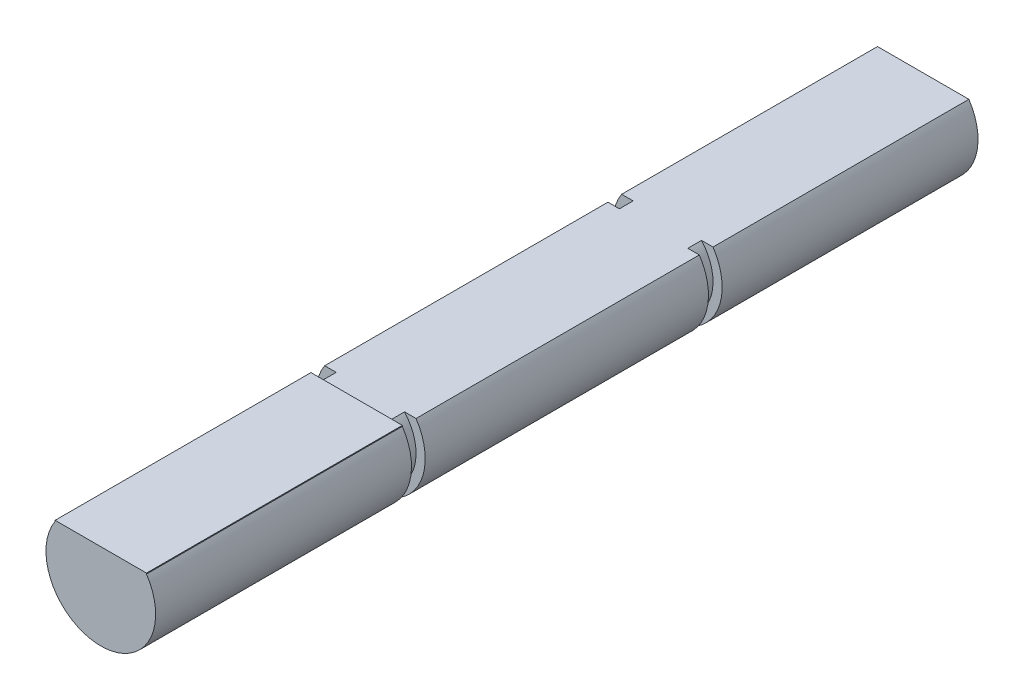
ISO-10303-21;
HEADER;
FILE_DESCRIPTION(('STEP AP214'),'2;1');
FILE_NAME('part.step','',(''),(''),'','','');
FILE_SCHEMA(('AUTOMOTIVE_DESIGN { 1 0 10303 214 1 1 1 1 }'));
ENDSEC;
DATA;
#1=APPLICATION_CONTEXT('core data for automotive mechanical design processes');
#2=APPLICATION_PROTOCOL_DEFINITION('international standard','automotive_design',2000,#1);
#3=PRODUCT_CONTEXT('',#1,'mechanical');
#4=PRODUCT('Part','Part','',(#3));
#5=PRODUCT_RELATED_PRODUCT_CATEGORY('part','',(#4));
#6=PRODUCT_DEFINITION_FORMATION('','',#4);
#7=PRODUCT_DEFINITION_CONTEXT('part definition',#1,'design');
#8=PRODUCT_DEFINITION('design','',#6,#7);
#9=PRODUCT_DEFINITION_SHAPE('','',#8);
#10=(LENGTH_UNIT() NAMED_UNIT(*) SI_UNIT(.MILLI.,.METRE.));
#11=(NAMED_UNIT(*) PLANE_ANGLE_UNIT() SI_UNIT($,.RADIAN.));
#12=(NAMED_UNIT(*) SI_UNIT($,.STERADIAN.) SOLID_ANGLE_UNIT());
#13=UNCERTAINTY_MEASURE_WITH_UNIT(LENGTH_MEASURE(1.E-05),#10,'distance_accuracy_value','');
#14=(GEOMETRIC_REPRESENTATION_CONTEXT(3) GLOBAL_UNCERTAINTY_ASSIGNED_CONTEXT((#13)) GLOBAL_UNIT_ASSIGNED_CONTEXT((#10,
#11,#12)) REPRESENTATION_CONTEXT('',''));
#15=CARTESIAN_POINT('',(0.,0.,0.));
#16=DIRECTION('',(0.,0.,1.));
#17=DIRECTION('',(1.,0.,0.));
#18=AXIS2_PLACEMENT_3D('',#15,#16,#17);
#19=CARTESIAN_POINT('',(-5.,3.3166247903554,45.));
#20=DIRECTION('',(0.,-1.,0.));
#21=DIRECTION('',(1.,0.,0.));
#22=AXIS2_PLACEMENT_3D('',#19,#20,#21);
#23=PLANE('',#22);
#24=DIRECTION('',(-1.,0.,0.));
#25=VECTOR('',#24,1.);
#26=CARTESIAN_POINT('',(-5.,3.3166247903554,17.));
#27=LINE('',#26,#25);
#28=CARTESIAN_POINT('',(3.74165738677392,3.3166247903554,17.));
#29=VERTEX_POINT('',#28);
#30=CARTESIAN_POINT('',(-3.74165738677381,3.3166247903554,17.));
#31=VERTEX_POINT('',#30);
#32=EDGE_CURVE('E148',#29,#31,#27,.T.);
#33=ORIENTED_EDGE('',*,*,#32,.F.);
#34=DIRECTION('',(0.,0.,1.));
#35=VECTOR('',#34,1.);
#36=CARTESIAN_POINT('',(3.7416573867773,3.3166247903554,1000.));
#37=LINE('',#36,#35);
#38=CARTESIAN_POINT('',(3.74165738677392,3.3166247903554,15.4999999999999));
#39=VERTEX_POINT('',#38);
#40=EDGE_CURVE('E208',#29,#39,#37,.F.);
#41=ORIENTED_EDGE('',*,*,#40,.T.);
#42=DIRECTION('',(1.,0.,0.));
#43=VECTOR('',#42,1.);
#44=CARTESIAN_POINT('',(-5.0000000000001,3.3166247903554,15.5));
#45=LINE('',#44,#43);
#46=CARTESIAN_POINT('',(5.,3.3166247903554,15.5));
#47=VERTEX_POINT('',#46);
#48=EDGE_CURVE('E207',#39,#47,#45,.T.);
#49=ORIENTED_EDGE('',*,*,#48,.T.);
#50=DIRECTION('',(0.,0.,-1.));
#51=VECTOR('',#50,1.);
#52=CARTESIAN_POINT('',(5.,3.3166247903554,45.));
#53=LINE('',#52,#51);
#54=CARTESIAN_POINT('',(5.,3.3166247903554,-15.5));
#55=VERTEX_POINT('',#54);
#56=EDGE_CURVE('E203',#47,#55,#53,.T.);
#57=ORIENTED_EDGE('',*,*,#56,.T.);
#58=DIRECTION('',(1.,0.,0.));
#59=VECTOR('',#58,1.);
#60=CARTESIAN_POINT('',(-5.0000000000001,3.3166247903554,-15.5));
#61=LINE('',#60,#59);
#62=CARTESIAN_POINT('',(3.74165738677392,3.3166247903554,-15.4999999999999));
#63=VERTEX_POINT('',#62);
#64=EDGE_CURVE('E178',#63,#55,#61,.T.);
#65=ORIENTED_EDGE('',*,*,#64,.F.);
#66=DIRECTION('',(0.,0.,-1.));
#67=VECTOR('',#66,1.);
#68=CARTESIAN_POINT('',(3.7416573867773,3.3166247903554,-1000.));
#69=LINE('',#68,#67);
#70=CARTESIAN_POINT('',(3.74165738677392,3.3166247903554,-17.));
#71=VERTEX_POINT('',#70);
#72=EDGE_CURVE('E181',#71,#63,#69,.F.);
#73=ORIENTED_EDGE('',*,*,#72,.F.);
#74=DIRECTION('',(-1.,0.,0.));
#75=VECTOR('',#74,1.);
#76=CARTESIAN_POINT('',(-5.0000000000001,3.3166247903554,-17.));
#77=LINE('',#76,#75);
#78=CARTESIAN_POINT('',(4.99999999999999,3.3166247903554,-17.));
#79=VERTEX_POINT('',#78);
#80=EDGE_CURVE('E185',#79,#71,#77,.T.);
#81=ORIENTED_EDGE('',*,*,#80,.F.);
#82=DIRECTION('',(0.,0.,1.));
#83=VECTOR('',#82,1.);
#84=CARTESIAN_POINT('',(5.,3.3166247903554,-45.));
#85=LINE('',#84,#83);
#86=CARTESIAN_POINT('',(5.,3.3166247903554,-45.));
#87=VERTEX_POINT('',#86);
#88=EDGE_CURVE('E175',#87,#79,#85,.T.);
#89=ORIENTED_EDGE('',*,*,#88,.F.);
#90=DIRECTION('',(-1.,0.,0.));
#91=VECTOR('',#90,1.);
#92=CARTESIAN_POINT('',(-5.,3.3166247903554,-45.));
#93=LINE('',#92,#91);
#94=CARTESIAN_POINT('',(-5.,3.3166247903554,-45.));
#95=VERTEX_POINT('',#94);
#96=EDGE_CURVE('E170',#87,#95,#93,.T.);
#97=ORIENTED_EDGE('',*,*,#96,.T.);
#98=DIRECTION('',(0.,0.,1.));
#99=VECTOR('',#98,1.);
#100=CARTESIAN_POINT('',(-5.,3.3166247903554,-45.));
#101=LINE('',#100,#99);
#102=CARTESIAN_POINT('',(-4.99999999999987,3.31662479035539,-17.));
#103=VERTEX_POINT('',#102);
#104=EDGE_CURVE('E172',#95,#103,#101,.T.);
#105=ORIENTED_EDGE('',*,*,#104,.T.);
#106=CARTESIAN_POINT('',(-3.74165738677381,3.3166247903554,-17.));
#107=VERTEX_POINT('',#106);
#108=EDGE_CURVE('E188',#107,#103,#77,.T.);
#109=ORIENTED_EDGE('',*,*,#108,.F.);
#110=DIRECTION('',(0.,0.,-1.));
#111=VECTOR('',#110,1.);
#112=CARTESIAN_POINT('',(-3.74165738677044,3.3166247903554,-1000.));
#113=LINE('',#112,#111);
#114=CARTESIAN_POINT('',(-3.74165738677382,3.3166247903554,-15.5));
#115=VERTEX_POINT('',#114);
#116=EDGE_CURVE('E189',#115,#107,#113,.T.);
#117=ORIENTED_EDGE('',*,*,#116,.F.);
#118=CARTESIAN_POINT('',(-4.99999999999988,3.3166247903554,-15.5));
#119=VERTEX_POINT('',#118);
#120=EDGE_CURVE('E182',#119,#115,#61,.T.);
#121=ORIENTED_EDGE('',*,*,#120,.F.);
#122=DIRECTION('',(0.,0.,-1.));
#123=VECTOR('',#122,1.);
#124=CARTESIAN_POINT('',(-5.,3.3166247903554,45.));
#125=LINE('',#124,#123);
#126=CARTESIAN_POINT('',(-4.99999999999988,3.3166247903554,15.5));
#127=VERTEX_POINT('',#126);
#128=EDGE_CURVE('E201',#127,#119,#125,.T.);
#129=ORIENTED_EDGE('',*,*,#128,.F.);
#130=CARTESIAN_POINT('',(-3.74165738677382,3.3166247903554,15.5));
#131=VERTEX_POINT('',#130);
#132=EDGE_CURVE('E47',#127,#131,#45,.T.);
#133=ORIENTED_EDGE('',*,*,#132,.T.);
#134=DIRECTION('',(0.,0.,1.));
#135=VECTOR('',#134,1.);
#136=CARTESIAN_POINT('',(-3.74165738677044,3.3166247903554,1000.));
#137=LINE('',#136,#135);
#138=EDGE_CURVE('E11',#131,#31,#137,.T.);
#139=ORIENTED_EDGE('',*,*,#138,.T.);
#140=EDGE_LOOP('',(#33,#41,#49,#57,#65,#73,#81,#89,#97,#105,#109,#117,#121,#129,#133,#139));
#141=FACE_BOUND('',#140,.T.);
#142=ADVANCED_FACE('F39',(#141),#23,.F.);
#143=CARTESIAN_POINT('',(0.,0.,45.));
#144=DIRECTION('',(0.,0.,-1.));
#145=DIRECTION('',(-1.,0.,0.));
#146=AXIS2_PLACEMENT_3D('',#143,#144,#145);
#147=CYLINDRICAL_SURFACE('',#146,6.);
#148=CARTESIAN_POINT('',(-5.,3.3166247903554,45.));
#149=VERTEX_POINT('',#148);
#150=CARTESIAN_POINT('',(-4.99999999999987,3.31662479035539,17.));
#151=VERTEX_POINT('',#150);
#152=EDGE_CURVE('E151',#149,#151,#125,.T.);
#153=ORIENTED_EDGE('',*,*,#152,.T.);
#154=CARTESIAN_POINT('',(0.,0.,17.));
#155=DIRECTION('',(0.,0.,1.));
#156=DIRECTION('',(1.,0.,0.));
#157=AXIS2_PLACEMENT_3D('',#154,#155,#156);
#158=CIRCLE('',#157,5.99999999999994);
#159=CARTESIAN_POINT('',(4.99999999999999,3.3166247903554,17.));
#160=VERTEX_POINT('',#159);
#161=EDGE_CURVE('E196',#151,#160,#158,.T.);
#162=ORIENTED_EDGE('',*,*,#161,.T.);
#163=CARTESIAN_POINT('',(5.,3.3166247903554,45.));
#164=VERTEX_POINT('',#163);
#165=EDGE_CURVE('E204',#164,#160,#53,.T.);
#166=ORIENTED_EDGE('',*,*,#165,.F.);
#167=CARTESIAN_POINT('',(0.,0.,45.));
#168=DIRECTION('',(0.,0.,1.));
#169=DIRECTION('',(1.,0.,0.));
#170=AXIS2_PLACEMENT_3D('',#167,#168,#169);
#171=CIRCLE('',#170,6.);
#172=EDGE_CURVE('E62',#149,#164,#171,.T.);
#173=ORIENTED_EDGE('',*,*,#172,.F.);
#174=EDGE_LOOP('',(#153,#162,#166,#173));
#175=FACE_BOUND('',#174,.T.);
#176=ADVANCED_FACE('F250',(#175),#147,.T.);
#177=ORIENTED_EDGE('',*,*,#56,.F.);
#178=CARTESIAN_POINT('',(0.,0.,15.5));
#179=DIRECTION('',(0.,0.,1.));
#180=DIRECTION('',(1.,0.,0.));
#181=AXIS2_PLACEMENT_3D('',#178,#179,#180);
#182=CIRCLE('',#181,5.99999999999995);
#183=EDGE_CURVE('E54',#127,#47,#182,.T.);
#184=ORIENTED_EDGE('',*,*,#183,.F.);
#185=ORIENTED_EDGE('',*,*,#128,.T.);
#186=CARTESIAN_POINT('',(0.,0.,-15.5));
#187=DIRECTION('',(0.,0.,1.));
#188=DIRECTION('',(1.,0.,0.));
#189=AXIS2_PLACEMENT_3D('',#186,#187,#188);
#190=CIRCLE('',#189,5.99999999999995);
#191=EDGE_CURVE('E154',#119,#55,#190,.T.);
#192=ORIENTED_EDGE('',*,*,#191,.T.);
#193=EDGE_LOOP('',(#177,#184,#185,#192));
#194=FACE_BOUND('',#193,.T.);
#195=ADVANCED_FACE('F41',(#194),#147,.T.);
#196=CARTESIAN_POINT('',(0.,0.,45.));
#197=DIRECTION('',(0.,0.,1.));
#198=DIRECTION('',(1.,0.,0.));
#199=AXIS2_PLACEMENT_3D('',#196,#197,#198);
#200=PLANE('',#199);
#201=ORIENTED_EDGE('',*,*,#172,.T.);
#202=DIRECTION('',(0.,-1.,0.));
#203=VECTOR('',#202,1.);
#204=CARTESIAN_POINT('',(5.,3.4166247903554,45.));
#205=LINE('',#204,#203);
#206=CARTESIAN_POINT('',(5.,3.4166247903554,45.));
#207=VERTEX_POINT('',#206);
#208=EDGE_CURVE('E135',#207,#164,#205,.T.);
#209=ORIENTED_EDGE('',*,*,#208,.F.);
#210=DIRECTION('',(1.,0.,0.));
#211=VECTOR('',#210,1.);
#212=CARTESIAN_POINT('',(-5.,3.4166247903554,45.));
#213=LINE('',#212,#211);
#214=CARTESIAN_POINT('',(-5.,3.4166247903554,45.));
#215=VERTEX_POINT('',#214);
#216=EDGE_CURVE('E128',#215,#207,#213,.T.);
#217=ORIENTED_EDGE('',*,*,#216,.F.);
#218=DIRECTION('',(0.,-1.,0.));
#219=VECTOR('',#218,1.);
#220=CARTESIAN_POINT('',(-5.,3.4166247903554,45.));
#221=LINE('',#220,#219);
#222=EDGE_CURVE('E132',#215,#149,#221,.T.);
#223=ORIENTED_EDGE('',*,*,#222,.T.);
#224=EDGE_LOOP('',(#201,#209,#217,#223));
#225=FACE_BOUND('',#224,.T.);
#226=ADVANCED_FACE('F130',(#225),#200,.T.);
#227=CARTESIAN_POINT('',(3.43024899888577E-12,0.,1000.));
#228=DIRECTION('',(0.,0.,1.));
#229=DIRECTION('',(1.,0.,0.));
#230=AXIS2_PLACEMENT_3D('',#227,#228,#229);
#231=CYLINDRICAL_SURFACE('',#230,4.99999999999994);
#232=CARTESIAN_POINT('',(0.,0.,17.));
#233=DIRECTION('',(0.,0.,1.));
#234=DIRECTION('',(1.,0.,0.));
#235=AXIS2_PLACEMENT_3D('',#232,#233,#234);
#236=CIRCLE('',#235,4.99999999999994);
#237=EDGE_CURVE('E198',#31,#29,#236,.T.);
#238=ORIENTED_EDGE('',*,*,#237,.F.);
#239=ORIENTED_EDGE('',*,*,#138,.F.);
#240=CARTESIAN_POINT('',(0.,0.,15.5));
#241=DIRECTION('',(0.,0.,1.));
#242=DIRECTION('',(1.,0.,0.));
#243=AXIS2_PLACEMENT_3D('',#240,#241,#242);
#244=CIRCLE('',#243,4.99999999999995);
#245=EDGE_CURVE('E192',#131,#39,#244,.T.);
#246=ORIENTED_EDGE('',*,*,#245,.T.);
#247=ORIENTED_EDGE('',*,*,#40,.F.);
#248=EDGE_LOOP('',(#238,#239,#246,#247));
#249=FACE_BOUND('',#248,.T.);
#250=ADVANCED_FACE('F257',(#249),#231,.T.);
#251=CARTESIAN_POINT('',(5.,0.,17.));
#252=DIRECTION('',(0.,0.,1.));
#253=DIRECTION('',(1.,0.,0.));
#254=AXIS2_PLACEMENT_3D('',#251,#252,#253);
#255=PLANE('',#254);
#256=ORIENTED_EDGE('',*,*,#161,.F.);
#257=DIRECTION('',(0.,-1.,0.));
#258=VECTOR('',#257,1.);
#259=CARTESIAN_POINT('',(-5.,3.4166247903554,17.));
#260=LINE('',#259,#258);
#261=CARTESIAN_POINT('',(-5.,3.4166247903554,17.));
#262=VERTEX_POINT('',#261);
#263=EDGE_CURVE('E399',#262,#151,#260,.T.);
#264=ORIENTED_EDGE('',*,*,#263,.F.);
#265=DIRECTION('',(-1.,0.,0.));
#266=VECTOR('',#265,1.);
#267=CARTESIAN_POINT('',(-5.,3.4166247903554,17.));
#268=LINE('',#267,#266);
#269=CARTESIAN_POINT('',(5.,3.4166247903554,17.));
#270=VERTEX_POINT('',#269);
#271=EDGE_CURVE('E144',#270,#262,#268,.T.);
#272=ORIENTED_EDGE('',*,*,#271,.F.);
#273=DIRECTION('',(0.,-1.,0.));
#274=VECTOR('',#273,1.);
#275=CARTESIAN_POINT('',(5.,3.4166247903554,17.));
#276=LINE('',#275,#274);
#277=EDGE_CURVE('E156',#270,#160,#276,.T.);
#278=ORIENTED_EDGE('',*,*,#277,.T.);
#279=EDGE_LOOP('',(#256,#264,#272,#278));
#280=FACE_BOUND('',#279,.T.);
#281=ORIENTED_EDGE('',*,*,#32,.T.);
#282=ORIENTED_EDGE('',*,*,#237,.T.);
#283=EDGE_LOOP('',(#281,#282));
#284=FACE_BOUND('',#283,.T.);
#285=ADVANCED_FACE('F260',(#280,#284),#255,.F.);
#286=CARTESIAN_POINT('',(5.,0.,15.5));
#287=DIRECTION('',(0.,0.,-1.));
#288=DIRECTION('',(-1.,0.,0.));
#289=AXIS2_PLACEMENT_3D('',#286,#287,#288);
#290=PLANE('',#289);
#291=ORIENTED_EDGE('',*,*,#183,.T.);
#292=ORIENTED_EDGE('',*,*,#48,.F.);
#293=ORIENTED_EDGE('',*,*,#245,.F.);
#294=ORIENTED_EDGE('',*,*,#132,.F.);
#295=EDGE_LOOP('',(#291,#292,#293,#294));
#296=FACE_BOUND('',#295,.T.);
#297=ADVANCED_FACE('F218',(#296),#290,.F.);
#298=CARTESIAN_POINT('',(0.,0.,-45.));
#299=DIRECTION('',(0.,0.,1.));
#300=DIRECTION('',(-1.,0.,0.));
#301=AXIS2_PLACEMENT_3D('',#298,#299,#300);
#302=CYLINDRICAL_SURFACE('',#301,6.);
#303=ORIENTED_EDGE('',*,*,#104,.F.);
#304=CARTESIAN_POINT('',(0.,0.,-45.));
#305=DIRECTION('',(0.,0.,1.));
#306=DIRECTION('',(1.,0.,0.));
#307=AXIS2_PLACEMENT_3D('',#304,#305,#306);
#308=CIRCLE('',#307,6.);
#309=EDGE_CURVE('E167',#95,#87,#308,.T.);
#310=ORIENTED_EDGE('',*,*,#309,.T.);
#311=ORIENTED_EDGE('',*,*,#88,.T.);
#312=CARTESIAN_POINT('',(0.,0.,-17.));
#313=DIRECTION('',(0.,0.,1.));
#314=DIRECTION('',(1.,0.,0.));
#315=AXIS2_PLACEMENT_3D('',#312,#313,#314);
#316=CIRCLE('',#315,5.99999999999994);
#317=EDGE_CURVE('E162',#103,#79,#316,.T.);
#318=ORIENTED_EDGE('',*,*,#317,.F.);
#319=EDGE_LOOP('',(#303,#310,#311,#318));
#320=FACE_BOUND('',#319,.T.);
#321=ADVANCED_FACE('F237',(#320),#302,.T.);
#322=CARTESIAN_POINT('',(0.,0.,-45.));
#323=DIRECTION('',(0.,0.,-1.));
#324=DIRECTION('',(1.,0.,0.));
#325=AXIS2_PLACEMENT_3D('',#322,#323,#324);
#326=PLANE('',#325);
#327=ORIENTED_EDGE('',*,*,#309,.F.);
#328=ORIENTED_EDGE('',*,*,#96,.F.);
#329=EDGE_LOOP('',(#327,#328));
#330=FACE_BOUND('',#329,.T.);
#331=ADVANCED_FACE('F240',(#330),#326,.T.);
#332=CARTESIAN_POINT('',(3.43024899888577E-12,0.,-1000.));
#333=DIRECTION('',(0.,0.,-1.));
#334=DIRECTION('',(1.,0.,0.));
#335=AXIS2_PLACEMENT_3D('',#332,#333,#334);
#336=CYLINDRICAL_SURFACE('',#335,4.99999999999994);
#337=CARTESIAN_POINT('',(0.,0.,-17.));
#338=DIRECTION('',(0.,0.,1.));
#339=DIRECTION('',(1.,0.,0.));
#340=AXIS2_PLACEMENT_3D('',#337,#338,#339);
#341=CIRCLE('',#340,4.99999999999994);
#342=EDGE_CURVE('E165',#107,#71,#341,.T.);
#343=ORIENTED_EDGE('',*,*,#342,.T.);
#344=ORIENTED_EDGE('',*,*,#72,.T.);
#345=CARTESIAN_POINT('',(0.,0.,-15.5));
#346=DIRECTION('',(0.,0.,1.));
#347=DIRECTION('',(1.,0.,0.));
#348=AXIS2_PLACEMENT_3D('',#345,#346,#347);
#349=CIRCLE('',#348,4.99999999999995);
#350=EDGE_CURVE('E152',#115,#63,#349,.T.);
#351=ORIENTED_EDGE('',*,*,#350,.F.);
#352=ORIENTED_EDGE('',*,*,#116,.T.);
#353=EDGE_LOOP('',(#343,#344,#351,#352));
#354=FACE_BOUND('',#353,.T.);
#355=ADVANCED_FACE('F229',(#354),#336,.T.);
#356=CARTESIAN_POINT('',(5.,0.,-17.));
#357=DIRECTION('',(0.,0.,-1.));
#358=DIRECTION('',(1.,0.,0.));
#359=AXIS2_PLACEMENT_3D('',#356,#357,#358);
#360=PLANE('',#359);
#361=ORIENTED_EDGE('',*,*,#317,.T.);
#362=ORIENTED_EDGE('',*,*,#80,.T.);
#363=ORIENTED_EDGE('',*,*,#342,.F.);
#364=ORIENTED_EDGE('',*,*,#108,.T.);
#365=EDGE_LOOP('',(#361,#362,#363,#364));
#366=FACE_BOUND('',#365,.T.);
#367=ADVANCED_FACE('F233',(#366),#360,.F.);
#368=CARTESIAN_POINT('',(5.,0.,-15.5));
#369=DIRECTION('',(0.,0.,1.));
#370=DIRECTION('',(-1.,0.,0.));
#371=AXIS2_PLACEMENT_3D('',#368,#369,#370);
#372=PLANE('',#371);
#373=ORIENTED_EDGE('',*,*,#191,.F.);
#374=ORIENTED_EDGE('',*,*,#120,.T.);
#375=ORIENTED_EDGE('',*,*,#350,.T.);
#376=ORIENTED_EDGE('',*,*,#64,.T.);
#377=EDGE_LOOP('',(#373,#374,#375,#376));
#378=FACE_BOUND('',#377,.T.);
#379=ADVANCED_FACE('F225',(#378),#372,.F.);
#380=CARTESIAN_POINT('',(-5.,3.4166247903554,45.));
#381=DIRECTION('',(1.,0.,0.));
#382=DIRECTION('',(0.,1.,0.));
#383=AXIS2_PLACEMENT_3D('',#380,#381,#382);
#384=PLANE('',#383);
#385=ORIENTED_EDGE('',*,*,#152,.F.);
#386=ORIENTED_EDGE('',*,*,#222,.F.);
#387=DIRECTION('',(0.,0.,1.));
#388=VECTOR('',#387,1.);
#389=CARTESIAN_POINT('',(-5.,3.4166247903554,45.));
#390=LINE('',#389,#388);
#391=EDGE_CURVE('E139',#262,#215,#390,.T.);
#392=ORIENTED_EDGE('',*,*,#391,.F.);
#393=ORIENTED_EDGE('',*,*,#263,.T.);
#394=EDGE_LOOP('',(#385,#386,#392,#393));
#395=FACE_BOUND('',#394,.T.);
#396=ADVANCED_FACE('F150',(#395),#384,.F.);
#397=CARTESIAN_POINT('',(5.,3.4166247903554,45.));
#398=DIRECTION('',(-1.,0.,0.));
#399=DIRECTION('',(0.,-1.,0.));
#400=AXIS2_PLACEMENT_3D('',#397,#398,#399);
#401=PLANE('',#400);
#402=ORIENTED_EDGE('',*,*,#165,.T.);
#403=ORIENTED_EDGE('',*,*,#277,.F.);
#404=DIRECTION('',(0.,0.,-1.));
#405=VECTOR('',#404,1.);
#406=CARTESIAN_POINT('',(5.,3.4166247903554,45.));
#407=LINE('',#406,#405);
#408=EDGE_CURVE('E138',#207,#270,#407,.T.);
#409=ORIENTED_EDGE('',*,*,#408,.F.);
#410=ORIENTED_EDGE('',*,*,#208,.T.);
#411=EDGE_LOOP('',(#402,#403,#409,#410));
#412=FACE_BOUND('',#411,.T.);
#413=ADVANCED_FACE('F316',(#412),#401,.F.);
#414=CARTESIAN_POINT('',(0.,3.4166247903554,0.));
#415=DIRECTION('',(0.,-1.,0.));
#416=DIRECTION('',(1.,0.,0.));
#417=AXIS2_PLACEMENT_3D('',#414,#415,#416);
#418=PLANE('',#417);
#419=ORIENTED_EDGE('',*,*,#391,.T.);
#420=ORIENTED_EDGE('',*,*,#216,.T.);
#421=ORIENTED_EDGE('',*,*,#408,.T.);
#422=ORIENTED_EDGE('',*,*,#271,.T.);
#423=EDGE_LOOP('',(#419,#420,#421,#422));
#424=FACE_BOUND('',#423,.T.);
#425=ADVANCED_FACE('F142',(#424),#418,.F.);
#426=CLOSED_SHELL('',(#142,#176,#195,#226,#250,#285,#297,#321,#331,#355,#367,#379,#396,#413,#425));
#427=MANIFOLD_SOLID_BREP('B2',#426);
#428=ADVANCED_BREP_SHAPE_REPRESENTATION('',(#18,#427),#14);
#429=SHAPE_DEFINITION_REPRESENTATION(#9,#428);
ENDSEC;
END-ISO-10303-21;
